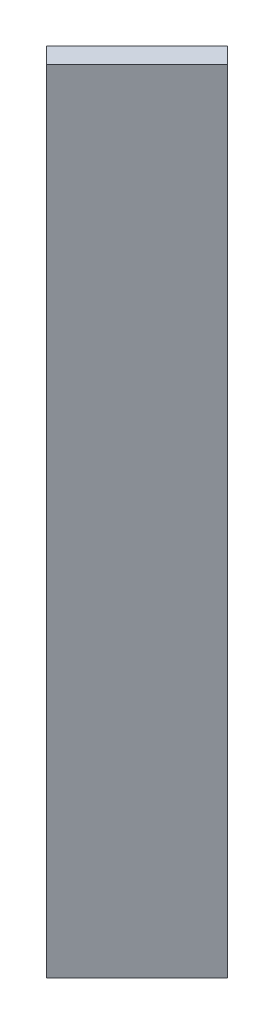
ISO-10303-21;
HEADER;
FILE_DESCRIPTION(('STEP AP214'),'2;1');
FILE_NAME('part.step','',(''),(''),'','','');
FILE_SCHEMA(('AUTOMOTIVE_DESIGN { 1 0 10303 214 1 1 1 1 }'));
ENDSEC;
DATA;
#1=APPLICATION_CONTEXT('core data for automotive mechanical design processes');
#2=APPLICATION_PROTOCOL_DEFINITION('international standard','automotive_design',2000,#1);
#3=PRODUCT_CONTEXT('',#1,'mechanical');
#4=PRODUCT('Part','Part','',(#3));
#5=PRODUCT_RELATED_PRODUCT_CATEGORY('part','',(#4));
#6=PRODUCT_DEFINITION_FORMATION('','',#4);
#7=PRODUCT_DEFINITION_CONTEXT('part definition',#1,'design');
#8=PRODUCT_DEFINITION('design','',#6,#7);
#9=PRODUCT_DEFINITION_SHAPE('','',#8);
#10=(LENGTH_UNIT() NAMED_UNIT(*) SI_UNIT(.MILLI.,.METRE.));
#11=(NAMED_UNIT(*) PLANE_ANGLE_UNIT() SI_UNIT($,.RADIAN.));
#12=(NAMED_UNIT(*) SI_UNIT($,.STERADIAN.) SOLID_ANGLE_UNIT());
#13=UNCERTAINTY_MEASURE_WITH_UNIT(LENGTH_MEASURE(1.E-05),#10,'distance_accuracy_value','');
#14=(GEOMETRIC_REPRESENTATION_CONTEXT(3) GLOBAL_UNCERTAINTY_ASSIGNED_CONTEXT((#13)) GLOBAL_UNIT_ASSIGNED_CONTEXT((#10,
#11,#12)) REPRESENTATION_CONTEXT('',''));
#15=CARTESIAN_POINT('',(0.,0.,0.));
#16=DIRECTION('',(0.,0.,1.));
#17=DIRECTION('',(1.,0.,0.));
#18=AXIS2_PLACEMENT_3D('',#15,#16,#17);
#19=CARTESIAN_POINT('',(10.560155931463,0.,10.560155931463));
#20=DIRECTION('',(-0.707106781186548,0.,-0.707106781186547));
#21=DIRECTION('',(-0.707106781186547,0.,0.707106781186548));
#22=AXIS2_PLACEMENT_3D('',#19,#20,#21);
#23=PLANE('',#22);
#24=DIRECTION('',(0.,-1.,0.));
#25=VECTOR('',#24,1.);
#26=CARTESIAN_POINT('',(-48.2287213378861,0.,69.3490332008122));
#27=LINE('',#26,#25);
#28=CARTESIAN_POINT('',(-48.2287213378861,31.3998645037643,69.3490332008122));
#29=VERTEX_POINT('',#28);
#30=CARTESIAN_POINT('',(-48.2287213378861,-3.20013549623574,69.3490332008122));
#31=VERTEX_POINT('',#30);
#32=EDGE_CURVE('E247',#29,#31,#27,.T.);
#33=ORIENTED_EDGE('',*,*,#32,.T.);
#34=DIRECTION('',(-0.707106781186547,0.,0.707106781186548));
#35=VECTOR('',#34,1.);
#36=CARTESIAN_POINT('',(10.560155931463,-3.20013549623574,10.560155931463));
#37=LINE('',#36,#35);
#38=CARTESIAN_POINT('',(-52.1885193125308,-3.20013549623574,73.3088311754569));
#39=VERTEX_POINT('',#38);
#40=EDGE_CURVE('E250',#31,#39,#37,.T.);
#41=ORIENTED_EDGE('',*,*,#40,.T.);
#42=DIRECTION('',(0.,1.,0.));
#43=VECTOR('',#42,1.);
#44=CARTESIAN_POINT('',(-52.1885193125308,0.,73.3088311754569));
#45=LINE('',#44,#43);
#46=CARTESIAN_POINT('',(-52.1885193125307,31.3998645037643,73.3088311754569));
#47=VERTEX_POINT('',#46);
#48=EDGE_CURVE('E253',#39,#47,#45,.T.);
#49=ORIENTED_EDGE('',*,*,#48,.T.);
#50=DIRECTION('',(0.707106781186547,0.,-0.707106781186548));
#51=VECTOR('',#50,1.);
#52=CARTESIAN_POINT('',(10.560155931463,31.3998645037643,10.560155931463));
#53=LINE('',#52,#51);
#54=EDGE_CURVE('E255',#47,#29,#53,.T.);
#55=ORIENTED_EDGE('',*,*,#54,.T.);
#56=EDGE_LOOP('',(#33,#41,#49,#55));
#57=FACE_BOUND('',#56,.T.);
#58=DIRECTION('',(-0.707106781186547,0.,0.707106781186547));
#59=VECTOR('',#58,1.);
#60=CARTESIAN_POINT('',(-48.8088255907336,-1.73092117145368,69.9291374536598));
#61=LINE('',#60,#59);
#62=CARTESIAN_POINT('',(-48.8088255907336,-1.73092117145368,69.9291374536598));
#63=VERTEX_POINT('',#62);
#64=CARTESIAN_POINT('',(-51.6084150596832,-1.73092117145368,72.7287269226093));
#65=VERTEX_POINT('',#64);
#66=EDGE_CURVE('E220',#63,#65,#61,.T.);
#67=ORIENTED_EDGE('',*,*,#66,.F.);
#68=DIRECTION('',(0.,-1.,0.));
#69=VECTOR('',#68,1.);
#70=CARTESIAN_POINT('',(-48.8088255907336,1.25733359690292,69.9291374536598));
#71=LINE('',#70,#69);
#72=CARTESIAN_POINT('',(-48.8088255907336,1.25733359690292,69.9291374536598));
#73=VERTEX_POINT('',#72);
#74=EDGE_CURVE('E202',#73,#63,#71,.T.);
#75=ORIENTED_EDGE('',*,*,#74,.F.);
#76=DIRECTION('',(0.707106781186547,0.,-0.707106781186547));
#77=VECTOR('',#76,1.);
#78=CARTESIAN_POINT('',(-48.8088255907336,1.25733359690292,69.9291374536598));
#79=LINE('',#78,#77);
#80=CARTESIAN_POINT('',(-51.6084150596832,1.25733359690292,72.7287269226093));
#81=VERTEX_POINT('',#80);
#82=EDGE_CURVE('E225',#81,#73,#79,.T.);
#83=ORIENTED_EDGE('',*,*,#82,.F.);
#84=DIRECTION('',(0.,1.,0.));
#85=VECTOR('',#84,1.);
#86=CARTESIAN_POINT('',(-51.6084150596832,1.25733359690292,72.7287269226093));
#87=LINE('',#86,#85);
#88=EDGE_CURVE('E222',#65,#81,#87,.T.);
#89=ORIENTED_EDGE('',*,*,#88,.F.);
#90=EDGE_LOOP('',(#67,#75,#83,#89));
#91=FACE_BOUND('',#90,.T.);
#92=DIRECTION('',(-0.707106781186547,0.,0.707106781186547));
#93=VECTOR('',#92,1.);
#94=CARTESIAN_POINT('',(-48.8088255907336,2.26907882854632,69.9291374536598));
#95=LINE('',#94,#93);
#96=CARTESIAN_POINT('',(-48.8088255907336,2.26907882854632,69.9291374536598));
#97=VERTEX_POINT('',#96);
#98=CARTESIAN_POINT('',(-51.6084150596832,2.26907882854632,72.7287269226093));
#99=VERTEX_POINT('',#98);
#100=EDGE_CURVE('E193',#97,#99,#95,.T.);
#101=ORIENTED_EDGE('',*,*,#100,.F.);
#102=DIRECTION('',(0.,-1.,0.));
#103=VECTOR('',#102,1.);
#104=CARTESIAN_POINT('',(-48.8088255907336,5.25733359690292,69.9291374536598));
#105=LINE('',#104,#103);
#106=CARTESIAN_POINT('',(-48.8088255907336,5.25733359690292,69.9291374536598));
#107=VERTEX_POINT('',#106);
#108=EDGE_CURVE('E162',#107,#97,#105,.T.);
#109=ORIENTED_EDGE('',*,*,#108,.F.);
#110=DIRECTION('',(0.707106781186547,0.,-0.707106781186547));
#111=VECTOR('',#110,1.);
#112=CARTESIAN_POINT('',(-48.8088255907336,5.25733359690292,69.9291374536598));
#113=LINE('',#112,#111);
#114=CARTESIAN_POINT('',(-51.6084150596832,5.25733359690292,72.7287269226093));
#115=VERTEX_POINT('',#114);
#116=EDGE_CURVE('E197',#115,#107,#113,.T.);
#117=ORIENTED_EDGE('',*,*,#116,.F.);
#118=DIRECTION('',(0.,1.,0.));
#119=VECTOR('',#118,1.);
#120=CARTESIAN_POINT('',(-51.6084150596832,5.25733359690292,72.7287269226093));
#121=LINE('',#120,#119);
#122=EDGE_CURVE('E195',#99,#115,#121,.T.);
#123=ORIENTED_EDGE('',*,*,#122,.F.);
#124=EDGE_LOOP('',(#101,#109,#117,#123));
#125=FACE_BOUND('',#124,.T.);
#126=DIRECTION('',(-0.707106781186547,0.,0.707106781186547));
#127=VECTOR('',#126,1.);
#128=CARTESIAN_POINT('',(-48.8088255907336,6.26907882854632,69.9291374536598));
#129=LINE('',#128,#127);
#130=CARTESIAN_POINT('',(-48.8088255907336,6.26907882854632,69.9291374536598));
#131=VERTEX_POINT('',#130);
#132=CARTESIAN_POINT('',(-51.6084150596832,6.26907882854632,72.7287269226093));
#133=VERTEX_POINT('',#132);
#134=EDGE_CURVE('E156',#131,#133,#129,.T.);
#135=ORIENTED_EDGE('',*,*,#134,.F.);
#136=DIRECTION('',(0.,-1.,0.));
#137=VECTOR('',#136,1.);
#138=CARTESIAN_POINT('',(-48.8088255907336,9.25733359690292,69.9291374536598));
#139=LINE('',#138,#137);
#140=CARTESIAN_POINT('',(-48.8088255907336,9.25733359690292,69.9291374536598));
#141=VERTEX_POINT('',#140);
#142=EDGE_CURVE('E167',#141,#131,#139,.T.);
#143=ORIENTED_EDGE('',*,*,#142,.F.);
#144=DIRECTION('',(0.707106781186547,0.,-0.707106781186547));
#145=VECTOR('',#144,1.);
#146=CARTESIAN_POINT('',(-48.8088255907336,9.25733359690292,69.9291374536598));
#147=LINE('',#146,#145);
#148=CARTESIAN_POINT('',(-51.6084150596832,9.25733359690292,72.7287269226093));
#149=VERTEX_POINT('',#148);
#150=EDGE_CURVE('E177',#149,#141,#147,.T.);
#151=ORIENTED_EDGE('',*,*,#150,.F.);
#152=DIRECTION('',(0.,1.,0.));
#153=VECTOR('',#152,1.);
#154=CARTESIAN_POINT('',(-51.6084150596832,9.25733359690292,72.7287269226093));
#155=LINE('',#154,#153);
#156=EDGE_CURVE('E175',#133,#149,#155,.T.);
#157=ORIENTED_EDGE('',*,*,#156,.F.);
#158=EDGE_LOOP('',(#135,#143,#151,#157));
#159=FACE_BOUND('',#158,.T.);
#160=ADVANCED_FACE('F37',(#57,#91,#125,#159),#23,.T.);
#161=CARTESIAN_POINT('',(-48.2287213378861,0.,69.3490332008122));
#162=DIRECTION('',(-0.707106781186547,0.,0.707106781186548));
#163=DIRECTION('',(0.707106781186548,0.,0.707106781186547));
#164=AXIS2_PLACEMENT_3D('',#161,#162,#163);
#165=PLANE('',#164);
#166=DIRECTION('',(0.,-1.,0.));
#167=VECTOR('',#166,1.);
#168=CARTESIAN_POINT('',(-47.5216145566996,0.,70.0561399819988));
#169=LINE('',#168,#167);
#170=CARTESIAN_POINT('',(-47.5216145566996,31.3998645037643,70.0561399819988));
#171=VERTEX_POINT('',#170);
#172=CARTESIAN_POINT('',(-47.5216145566996,-3.20013549623574,70.0561399819988));
#173=VERTEX_POINT('',#172);
#174=EDGE_CURVE('E230',#171,#173,#169,.T.);
#175=ORIENTED_EDGE('',*,*,#174,.T.);
#176=DIRECTION('',(0.707106781186548,0.,0.707106781186547));
#177=VECTOR('',#176,1.);
#178=CARTESIAN_POINT('',(-48.2287213378861,-3.20013549623574,69.3490332008122));
#179=LINE('',#178,#177);
#180=EDGE_CURVE('E11',#31,#173,#179,.T.);
#181=ORIENTED_EDGE('',*,*,#180,.F.);
#182=ORIENTED_EDGE('',*,*,#32,.F.);
#183=DIRECTION('',(0.707106781186548,0.,0.707106781186547));
#184=VECTOR('',#183,1.);
#185=CARTESIAN_POINT('',(-48.2287213378861,31.3998645037643,69.3490332008122));
#186=LINE('',#185,#184);
#187=EDGE_CURVE('E257',#29,#171,#186,.T.);
#188=ORIENTED_EDGE('',*,*,#187,.T.);
#189=EDGE_LOOP('',(#175,#181,#182,#188));
#190=FACE_BOUND('',#189,.T.);
#191=ADVANCED_FACE('F39',(#190),#165,.F.);
#192=CARTESIAN_POINT('',(10.560155931463,-3.20013549623574,10.560155931463));
#193=DIRECTION('',(0.,1.,0.));
#194=DIRECTION('',(0.,0.,1.));
#195=AXIS2_PLACEMENT_3D('',#192,#193,#194);
#196=PLANE('',#195);
#197=DIRECTION('',(-0.707106781186547,0.,0.707106781186548));
#198=VECTOR('',#197,1.);
#199=CARTESIAN_POINT('',(11.2672627126496,-3.20013549623574,11.2672627126496));
#200=LINE('',#199,#198);
#201=CARTESIAN_POINT('',(-51.4814125313442,-3.20013549623574,74.0159379566434));
#202=VERTEX_POINT('',#201);
#203=EDGE_CURVE('E260',#173,#202,#200,.T.);
#204=ORIENTED_EDGE('',*,*,#203,.T.);
#205=DIRECTION('',(0.707106781186548,0.,0.707106781186547));
#206=VECTOR('',#205,1.);
#207=CARTESIAN_POINT('',(-52.1885193125308,-3.20013549623574,73.3088311754569));
#208=LINE('',#207,#206);
#209=EDGE_CURVE('E45',#39,#202,#208,.T.);
#210=ORIENTED_EDGE('',*,*,#209,.F.);
#211=ORIENTED_EDGE('',*,*,#40,.F.);
#212=ORIENTED_EDGE('',*,*,#180,.T.);
#213=EDGE_LOOP('',(#204,#210,#211,#212));
#214=FACE_BOUND('',#213,.T.);
#215=ADVANCED_FACE('F290',(#214),#196,.F.);
#216=CARTESIAN_POINT('',(-52.1885193125308,0.,73.3088311754569));
#217=DIRECTION('',(0.707106781186547,0.,-0.707106781186548));
#218=DIRECTION('',(-0.707106781186548,0.,-0.707106781186547));
#219=AXIS2_PLACEMENT_3D('',#216,#217,#218);
#220=PLANE('',#219);
#221=DIRECTION('',(0.,1.,0.));
#222=VECTOR('',#221,1.);
#223=CARTESIAN_POINT('',(-51.4814125313442,0.,74.0159379566434));
#224=LINE('',#223,#222);
#225=CARTESIAN_POINT('',(-51.4814125313442,31.3998645037643,74.0159379566434));
#226=VERTEX_POINT('',#225);
#227=EDGE_CURVE('E262',#202,#226,#224,.T.);
#228=ORIENTED_EDGE('',*,*,#227,.T.);
#229=DIRECTION('',(0.707106781186548,0.,0.707106781186547));
#230=VECTOR('',#229,1.);
#231=CARTESIAN_POINT('',(-52.1885193125307,31.3998645037643,73.3088311754569));
#232=LINE('',#231,#230);
#233=EDGE_CURVE('E267',#47,#226,#232,.T.);
#234=ORIENTED_EDGE('',*,*,#233,.F.);
#235=ORIENTED_EDGE('',*,*,#48,.F.);
#236=ORIENTED_EDGE('',*,*,#209,.T.);
#237=EDGE_LOOP('',(#228,#234,#235,#236));
#238=FACE_BOUND('',#237,.T.);
#239=ADVANCED_FACE('F274',(#238),#220,.F.);
#240=CARTESIAN_POINT('',(10.560155931463,31.3998645037643,10.560155931463));
#241=DIRECTION('',(0.,-1.,0.));
#242=DIRECTION('',(0.,0.,-1.));
#243=AXIS2_PLACEMENT_3D('',#240,#241,#242);
#244=PLANE('',#243);
#245=DIRECTION('',(0.707106781186547,0.,-0.707106781186548));
#246=VECTOR('',#245,1.);
#247=CARTESIAN_POINT('',(11.2672627126496,31.3998645037643,11.2672627126496));
#248=LINE('',#247,#246);
#249=EDGE_CURVE('E251',#226,#171,#248,.T.);
#250=ORIENTED_EDGE('',*,*,#249,.T.);
#251=ORIENTED_EDGE('',*,*,#187,.F.);
#252=ORIENTED_EDGE('',*,*,#54,.F.);
#253=ORIENTED_EDGE('',*,*,#233,.T.);
#254=EDGE_LOOP('',(#250,#251,#252,#253));
#255=FACE_BOUND('',#254,.T.);
#256=ADVANCED_FACE('F283',(#255),#244,.F.);
#257=CARTESIAN_POINT('',(11.2672627126496,0.,11.2672627126496));
#258=DIRECTION('',(-0.707106781186548,0.,-0.707106781186547));
#259=DIRECTION('',(-0.707106781186547,0.,0.707106781186548));
#260=AXIS2_PLACEMENT_3D('',#257,#258,#259);
#261=PLANE('',#260);
#262=ORIENTED_EDGE('',*,*,#174,.F.);
#263=ORIENTED_EDGE('',*,*,#249,.F.);
#264=ORIENTED_EDGE('',*,*,#227,.F.);
#265=ORIENTED_EDGE('',*,*,#203,.F.);
#266=EDGE_LOOP('',(#262,#263,#264,#265));
#267=FACE_BOUND('',#266,.T.);
#268=ADVANCED_FACE('F280',(#267),#261,.F.);
#269=CARTESIAN_POINT('',(-48.8088255907336,1.25733359690292,69.9291374536598));
#270=DIRECTION('',(0.515038074910054,0.,-0.857167300702112));
#271=DIRECTION('',(-0.857167300702113,0.,-0.515038074910054));
#272=AXIS2_PLACEMENT_3D('',#269,#270,#271);
#273=PLANE('',#272);
#274=ORIENTED_EDGE('',*,*,#74,.T.);
#275=DIRECTION('',(0.833133866136367,-0.235138839312811,0.500597330539521));
#276=VECTOR('',#275,1.);
#277=CARTESIAN_POINT('',(-48.8088255907336,-1.73092117145368,69.9291374536598));
#278=LINE('',#277,#276);
#279=CARTESIAN_POINT('',(-50.1339380448387,-1.3569291671889,69.1329295642051));
#280=VERTEX_POINT('',#279);
#281=EDGE_CURVE('E228',#280,#63,#278,.T.);
#282=ORIENTED_EDGE('',*,*,#281,.F.);
#283=DIRECTION('',(0.,1.,0.));
#284=VECTOR('',#283,1.);
#285=CARTESIAN_POINT('',(-50.1339380448387,1.25733359690292,69.1329295642051));
#286=LINE('',#285,#284);
#287=CARTESIAN_POINT('',(-50.1339380448387,0.883341592638149,69.1329295642051));
#288=VERTEX_POINT('',#287);
#289=EDGE_CURVE('E227',#288,#280,#286,.F.);
#290=ORIENTED_EDGE('',*,*,#289,.F.);
#291=DIRECTION('',(0.833133866136367,0.23513883931281,0.500597330539521));
#292=VECTOR('',#291,1.);
#293=CARTESIAN_POINT('',(-48.8088255907336,1.25733359690292,69.9291374536598));
#294=LINE('',#293,#292);
#295=EDGE_CURVE('E232',#288,#73,#294,.T.);
#296=ORIENTED_EDGE('',*,*,#295,.T.);
#297=EDGE_LOOP('',(#274,#282,#290,#296));
#298=FACE_BOUND('',#297,.T.);
#299=ADVANCED_FACE('F307',(#298),#273,.T.);
#300=CARTESIAN_POINT('',(-48.8088255907336,-1.73092117145368,69.9291374536598));
#301=DIRECTION('',(-0.171064612896029,-0.970295726275996,-0.171064612896029));
#302=DIRECTION('',(0.984812040359576,-0.173623861156264,0.));
#303=AXIS2_PLACEMENT_3D('',#300,#301,#302);
#304=PLANE('',#303);
#305=ORIENTED_EDGE('',*,*,#66,.T.);
#306=DIRECTION('',(0.500597330539522,-0.235138839312811,0.833133866136366));
#307=VECTOR('',#306,1.);
#308=CARTESIAN_POINT('',(-51.96016215573,-1.56569974726641,72.1433214476824));
#309=LINE('',#308,#307);
#310=CARTESIAN_POINT('',(-52.4046229491379,-1.3569291671889,71.4036144685043));
#311=VERTEX_POINT('',#310);
#312=EDGE_CURVE('E231',#311,#65,#309,.T.);
#313=ORIENTED_EDGE('',*,*,#312,.F.);
#314=DIRECTION('',(0.707106781186548,0.,-0.707106781186548));
#315=VECTOR('',#314,1.);
#316=CARTESIAN_POINT('',(-49.8694857625135,-1.3569291671889,68.8684772818799));
#317=LINE('',#316,#315);
#318=EDGE_CURVE('E242',#280,#311,#317,.F.);
#319=ORIENTED_EDGE('',*,*,#318,.F.);
#320=ORIENTED_EDGE('',*,*,#281,.T.);
#321=EDGE_LOOP('',(#305,#313,#319,#320));
#322=FACE_BOUND('',#321,.T.);
#323=ADVANCED_FACE('F303',(#322),#304,.T.);
#324=CARTESIAN_POINT('',(-51.6084150596832,1.25733359690292,72.7287269226093));
#325=DIRECTION('',(-0.857167300702112,0.,0.515038074910055));
#326=DIRECTION('',(0.515038074910055,0.,0.857167300702112));
#327=AXIS2_PLACEMENT_3D('',#324,#325,#326);
#328=PLANE('',#327);
#329=ORIENTED_EDGE('',*,*,#88,.T.);
#330=DIRECTION('',(0.500597330539522,0.23513883931281,0.833133866136366));
#331=VECTOR('',#330,1.);
#332=CARTESIAN_POINT('',(-52.0744540455257,1.03842738322534,71.9531078004963));
#333=LINE('',#332,#331);
#334=CARTESIAN_POINT('',(-52.4046229491379,0.883341592638151,71.4036144685043));
#335=VERTEX_POINT('',#334);
#336=EDGE_CURVE('E235',#335,#81,#333,.T.);
#337=ORIENTED_EDGE('',*,*,#336,.F.);
#338=DIRECTION('',(0.,-1.,0.));
#339=VECTOR('',#338,1.);
#340=CARTESIAN_POINT('',(-52.4046229491379,1.25733359690292,71.4036144685043));
#341=LINE('',#340,#339);
#342=EDGE_CURVE('E244',#311,#335,#341,.F.);
#343=ORIENTED_EDGE('',*,*,#342,.F.);
#344=ORIENTED_EDGE('',*,*,#312,.T.);
#345=EDGE_LOOP('',(#329,#337,#343,#344));
#346=FACE_BOUND('',#345,.T.);
#347=ADVANCED_FACE('F333',(#346),#328,.T.);
#348=CARTESIAN_POINT('',(-48.8088255907336,1.25733359690292,69.9291374536598));
#349=DIRECTION('',(-0.171064612896029,0.970295726275996,-0.171064612896029));
#350=DIRECTION('',(0.,0.173623861156263,0.984812040359576));
#351=AXIS2_PLACEMENT_3D('',#348,#349,#350);
#352=PLANE('',#351);
#353=ORIENTED_EDGE('',*,*,#82,.T.);
#354=ORIENTED_EDGE('',*,*,#295,.F.);
#355=DIRECTION('',(-0.707106781186548,0.,0.707106781186548));
#356=VECTOR('',#355,1.);
#357=CARTESIAN_POINT('',(-49.8694857625135,0.883341592638149,68.8684772818799));
#358=LINE('',#357,#356);
#359=EDGE_CURVE('E236',#335,#288,#358,.F.);
#360=ORIENTED_EDGE('',*,*,#359,.F.);
#361=ORIENTED_EDGE('',*,*,#336,.T.);
#362=EDGE_LOOP('',(#353,#354,#360,#361));
#363=FACE_BOUND('',#362,.T.);
#364=ADVANCED_FACE('F341',(#363),#352,.T.);
#365=CARTESIAN_POINT('',(9.49949575968323,0.,9.49949575968323));
#366=DIRECTION('',(-0.707106781186547,0.,-0.707106781186547));
#367=DIRECTION('',(-0.707106781186548,0.,0.707106781186548));
#368=AXIS2_PLACEMENT_3D('',#365,#366,#367);
#369=PLANE('',#368);
#370=ORIENTED_EDGE('',*,*,#289,.T.);
#371=ORIENTED_EDGE('',*,*,#318,.T.);
#372=ORIENTED_EDGE('',*,*,#342,.T.);
#373=ORIENTED_EDGE('',*,*,#359,.T.);
#374=EDGE_LOOP('',(#370,#371,#372,#373));
#375=FACE_BOUND('',#374,.T.);
#376=ADVANCED_FACE('F349',(#375),#369,.T.);
#377=CARTESIAN_POINT('',(-48.8088255907336,5.25733359690292,69.9291374536598));
#378=DIRECTION('',(0.515038074910054,0.,-0.857167300702113));
#379=DIRECTION('',(-0.857167300702113,0.,-0.515038074910054));
#380=AXIS2_PLACEMENT_3D('',#377,#378,#379);
#381=PLANE('',#380);
#382=ORIENTED_EDGE('',*,*,#108,.T.);
#383=DIRECTION('',(0.833133866136367,-0.235138839312811,0.500597330539521));
#384=VECTOR('',#383,1.);
#385=CARTESIAN_POINT('',(-48.8088255907336,2.26907882854632,69.9291374536598));
#386=LINE('',#385,#384);
#387=CARTESIAN_POINT('',(-50.1339380448386,2.64307083281109,69.1329295642051));
#388=VERTEX_POINT('',#387);
#389=EDGE_CURVE('E200',#388,#97,#386,.T.);
#390=ORIENTED_EDGE('',*,*,#389,.F.);
#391=DIRECTION('',(0.,1.,0.));
#392=VECTOR('',#391,1.);
#393=CARTESIAN_POINT('',(-50.1339380448386,5.25733359690292,69.1329295642051));
#394=LINE('',#393,#392);
#395=CARTESIAN_POINT('',(-50.1339380448386,4.88334159263815,69.1329295642051));
#396=VERTEX_POINT('',#395);
#397=EDGE_CURVE('E199',#396,#388,#394,.F.);
#398=ORIENTED_EDGE('',*,*,#397,.F.);
#399=DIRECTION('',(0.833133866136367,0.23513883931281,0.500597330539521));
#400=VECTOR('',#399,1.);
#401=CARTESIAN_POINT('',(-48.8088255907336,5.25733359690292,69.9291374536598));
#402=LINE('',#401,#400);
#403=EDGE_CURVE('E204',#396,#107,#402,.T.);
#404=ORIENTED_EDGE('',*,*,#403,.T.);
#405=EDGE_LOOP('',(#382,#390,#398,#404));
#406=FACE_BOUND('',#405,.T.);
#407=ADVANCED_FACE('F358',(#406),#381,.T.);
#408=CARTESIAN_POINT('',(-48.8088255907336,2.26907882854632,69.9291374536598));
#409=DIRECTION('',(-0.171064612896029,-0.970295726275996,-0.171064612896029));
#410=DIRECTION('',(0.984812040359576,-0.173623861156264,0.));
#411=AXIS2_PLACEMENT_3D('',#408,#409,#410);
#412=PLANE('',#411);
#413=ORIENTED_EDGE('',*,*,#100,.T.);
#414=DIRECTION('',(0.500597330539522,-0.235138839312811,0.833133866136366));
#415=VECTOR('',#414,1.);
#416=CARTESIAN_POINT('',(-51.96016215573,2.43430025273359,72.1433214476824));
#417=LINE('',#416,#415);
#418=CARTESIAN_POINT('',(-52.4046229491379,2.6430708328111,71.4036144685043));
#419=VERTEX_POINT('',#418);
#420=EDGE_CURVE('E203',#419,#99,#417,.T.);
#421=ORIENTED_EDGE('',*,*,#420,.F.);
#422=DIRECTION('',(0.707106781186547,0.,-0.707106781186547));
#423=VECTOR('',#422,1.);
#424=CARTESIAN_POINT('',(-49.8694857625135,2.64307083281109,68.8684772818799));
#425=LINE('',#424,#423);
#426=EDGE_CURVE('E213',#388,#419,#425,.F.);
#427=ORIENTED_EDGE('',*,*,#426,.F.);
#428=ORIENTED_EDGE('',*,*,#389,.T.);
#429=EDGE_LOOP('',(#413,#421,#427,#428));
#430=FACE_BOUND('',#429,.T.);
#431=ADVANCED_FACE('F367',(#430),#412,.T.);
#432=CARTESIAN_POINT('',(-51.6084150596832,5.25733359690292,72.7287269226093));
#433=DIRECTION('',(-0.857167300702112,0.,0.515038074910055));
#434=DIRECTION('',(0.515038074910055,0.,0.857167300702112));
#435=AXIS2_PLACEMENT_3D('',#432,#433,#434);
#436=PLANE('',#435);
#437=ORIENTED_EDGE('',*,*,#122,.T.);
#438=DIRECTION('',(0.500597330539522,0.23513883931281,0.833133866136366));
#439=VECTOR('',#438,1.);
#440=CARTESIAN_POINT('',(-52.0744540455257,5.03842738322534,71.9531078004963));
#441=LINE('',#440,#439);
#442=CARTESIAN_POINT('',(-52.4046229491379,4.88334159263815,71.4036144685043));
#443=VERTEX_POINT('',#442);
#444=EDGE_CURVE('E60',#443,#115,#441,.T.);
#445=ORIENTED_EDGE('',*,*,#444,.F.);
#446=DIRECTION('',(0.,-1.,0.));
#447=VECTOR('',#446,1.);
#448=CARTESIAN_POINT('',(-52.4046229491379,5.25733359690292,71.4036144685044));
#449=LINE('',#448,#447);
#450=EDGE_CURVE('E215',#419,#443,#449,.F.);
#451=ORIENTED_EDGE('',*,*,#450,.F.);
#452=ORIENTED_EDGE('',*,*,#420,.T.);
#453=EDGE_LOOP('',(#437,#445,#451,#452));
#454=FACE_BOUND('',#453,.T.);
#455=ADVANCED_FACE('F376',(#454),#436,.T.);
#456=CARTESIAN_POINT('',(-48.8088255907336,5.25733359690292,69.9291374536598));
#457=DIRECTION('',(-0.171064612896029,0.970295726275996,-0.171064612896029));
#458=DIRECTION('',(0.,0.173623861156263,0.984812040359576));
#459=AXIS2_PLACEMENT_3D('',#456,#457,#458);
#460=PLANE('',#459);
#461=ORIENTED_EDGE('',*,*,#116,.T.);
#462=ORIENTED_EDGE('',*,*,#403,.F.);
#463=DIRECTION('',(-0.707106781186547,0.,0.707106781186547));
#464=VECTOR('',#463,1.);
#465=CARTESIAN_POINT('',(-49.8694857625135,4.88334159263815,68.8684772818799));
#466=LINE('',#465,#464);
#467=EDGE_CURVE('E207',#443,#396,#466,.F.);
#468=ORIENTED_EDGE('',*,*,#467,.F.);
#469=ORIENTED_EDGE('',*,*,#444,.T.);
#470=EDGE_LOOP('',(#461,#462,#468,#469));
#471=FACE_BOUND('',#470,.T.);
#472=ADVANCED_FACE('F385',(#471),#460,.T.);
#473=CARTESIAN_POINT('',(9.49949575968324,0.,9.49949575968324));
#474=DIRECTION('',(-0.707106781186548,0.,-0.707106781186548));
#475=DIRECTION('',(-0.707106781186548,0.,0.707106781186548));
#476=AXIS2_PLACEMENT_3D('',#473,#474,#475);
#477=PLANE('',#476);
#478=ORIENTED_EDGE('',*,*,#397,.T.);
#479=ORIENTED_EDGE('',*,*,#426,.T.);
#480=ORIENTED_EDGE('',*,*,#450,.T.);
#481=ORIENTED_EDGE('',*,*,#467,.T.);
#482=EDGE_LOOP('',(#478,#479,#480,#481));
#483=FACE_BOUND('',#482,.T.);
#484=ADVANCED_FACE('F394',(#483),#477,.T.);
#485=CARTESIAN_POINT('',(-48.8088255907336,9.25733359690292,69.9291374536598));
#486=DIRECTION('',(0.515038074910054,0.,-0.857167300702113));
#487=DIRECTION('',(-0.857167300702113,0.,-0.515038074910054));
#488=AXIS2_PLACEMENT_3D('',#485,#486,#487);
#489=PLANE('',#488);
#490=ORIENTED_EDGE('',*,*,#142,.T.);
#491=DIRECTION('',(0.833133866136367,-0.235138839312811,0.500597330539521));
#492=VECTOR('',#491,1.);
#493=CARTESIAN_POINT('',(-48.8088255907336,6.26907882854632,69.9291374536598));
#494=LINE('',#493,#492);
#495=CARTESIAN_POINT('',(-50.1339380448386,6.64307083281109,69.1329295642051));
#496=VERTEX_POINT('',#495);
#497=EDGE_CURVE('E151',#496,#131,#494,.T.);
#498=ORIENTED_EDGE('',*,*,#497,.F.);
#499=DIRECTION('',(0.,1.,0.));
#500=VECTOR('',#499,1.);
#501=CARTESIAN_POINT('',(-50.1339380448386,9.25733359690292,69.1329295642051));
#502=LINE('',#501,#500);
#503=CARTESIAN_POINT('',(-50.1339380448386,8.88334159263815,69.1329295642051));
#504=VERTEX_POINT('',#503);
#505=EDGE_CURVE('E180',#504,#496,#502,.F.);
#506=ORIENTED_EDGE('',*,*,#505,.F.);
#507=DIRECTION('',(0.833133866136367,0.23513883931281,0.500597330539521));
#508=VECTOR('',#507,1.);
#509=CARTESIAN_POINT('',(-48.8088255907336,9.25733359690292,69.9291374536598));
#510=LINE('',#509,#508);
#511=EDGE_CURVE('E170',#504,#141,#510,.T.);
#512=ORIENTED_EDGE('',*,*,#511,.T.);
#513=EDGE_LOOP('',(#490,#498,#506,#512));
#514=FACE_BOUND('',#513,.T.);
#515=ADVANCED_FACE('F168',(#514),#489,.T.);
#516=CARTESIAN_POINT('',(-48.8088255907336,6.26907882854632,69.9291374536598));
#517=DIRECTION('',(-0.171064612896029,-0.970295726275996,-0.171064612896029));
#518=DIRECTION('',(0.984812040359576,-0.173623861156264,0.));
#519=AXIS2_PLACEMENT_3D('',#516,#517,#518);
#520=PLANE('',#519);
#521=ORIENTED_EDGE('',*,*,#134,.T.);
#522=DIRECTION('',(0.500597330539522,-0.235138839312811,0.833133866136366));
#523=VECTOR('',#522,1.);
#524=CARTESIAN_POINT('',(-51.96016215573,6.43430025273359,72.1433214476824));
#525=LINE('',#524,#523);
#526=CARTESIAN_POINT('',(-52.4046229491379,6.6430708328111,71.4036144685043));
#527=VERTEX_POINT('',#526);
#528=EDGE_CURVE('E163',#527,#133,#525,.T.);
#529=ORIENTED_EDGE('',*,*,#528,.F.);
#530=DIRECTION('',(0.707106781186547,0.,-0.707106781186547));
#531=VECTOR('',#530,1.);
#532=CARTESIAN_POINT('',(-49.8694857625135,6.64307083281109,68.8684772818799));
#533=LINE('',#532,#531);
#534=EDGE_CURVE('E158',#496,#527,#533,.F.);
#535=ORIENTED_EDGE('',*,*,#534,.F.);
#536=ORIENTED_EDGE('',*,*,#497,.T.);
#537=EDGE_LOOP('',(#521,#529,#535,#536));
#538=FACE_BOUND('',#537,.T.);
#539=ADVANCED_FACE('F153',(#538),#520,.T.);
#540=CARTESIAN_POINT('',(-51.6084150596832,9.25733359690292,72.7287269226093));
#541=DIRECTION('',(-0.857167300702112,0.,0.515038074910055));
#542=DIRECTION('',(0.515038074910055,0.,0.857167300702112));
#543=AXIS2_PLACEMENT_3D('',#540,#541,#542);
#544=PLANE('',#543);
#545=ORIENTED_EDGE('',*,*,#156,.T.);
#546=DIRECTION('',(0.500597330539522,0.235138839312811,0.833133866136366));
#547=VECTOR('',#546,1.);
#548=CARTESIAN_POINT('',(-52.0744540455257,9.03842738322534,71.9531078004963));
#549=LINE('',#548,#547);
#550=CARTESIAN_POINT('',(-52.4046229491379,8.88334159263815,71.4036144685043));
#551=VERTEX_POINT('',#550);
#552=EDGE_CURVE('E52',#551,#149,#549,.T.);
#553=ORIENTED_EDGE('',*,*,#552,.F.);
#554=DIRECTION('',(0.,-1.,0.));
#555=VECTOR('',#554,1.);
#556=CARTESIAN_POINT('',(-52.4046229491379,9.25733359690292,71.4036144685044));
#557=LINE('',#556,#555);
#558=EDGE_CURVE('E188',#527,#551,#557,.F.);
#559=ORIENTED_EDGE('',*,*,#558,.F.);
#560=ORIENTED_EDGE('',*,*,#528,.T.);
#561=EDGE_LOOP('',(#545,#553,#559,#560));
#562=FACE_BOUND('',#561,.T.);
#563=ADVANCED_FACE('F417',(#562),#544,.T.);
#564=CARTESIAN_POINT('',(-48.8088255907336,9.25733359690292,69.9291374536598));
#565=DIRECTION('',(-0.171064612896029,0.970295726275996,-0.171064612896029));
#566=DIRECTION('',(0.,0.173623861156264,0.984812040359576));
#567=AXIS2_PLACEMENT_3D('',#564,#565,#566);
#568=PLANE('',#567);
#569=ORIENTED_EDGE('',*,*,#150,.T.);
#570=ORIENTED_EDGE('',*,*,#511,.F.);
#571=DIRECTION('',(-0.707106781186547,0.,0.707106781186547));
#572=VECTOR('',#571,1.);
#573=CARTESIAN_POINT('',(-49.8694857625135,8.88334159263815,68.8684772818799));
#574=LINE('',#573,#572);
#575=EDGE_CURVE('E183',#551,#504,#574,.F.);
#576=ORIENTED_EDGE('',*,*,#575,.F.);
#577=ORIENTED_EDGE('',*,*,#552,.T.);
#578=EDGE_LOOP('',(#569,#570,#576,#577));
#579=FACE_BOUND('',#578,.T.);
#580=ADVANCED_FACE('F425',(#579),#568,.T.);
#581=CARTESIAN_POINT('',(9.49949575968324,0.,9.49949575968324));
#582=DIRECTION('',(-0.707106781186548,0.,-0.707106781186548));
#583=DIRECTION('',(-0.707106781186548,0.,0.707106781186548));
#584=AXIS2_PLACEMENT_3D('',#581,#582,#583);
#585=PLANE('',#584);
#586=ORIENTED_EDGE('',*,*,#505,.T.);
#587=ORIENTED_EDGE('',*,*,#534,.T.);
#588=ORIENTED_EDGE('',*,*,#558,.T.);
#589=ORIENTED_EDGE('',*,*,#575,.T.);
#590=EDGE_LOOP('',(#586,#587,#588,#589));
#591=FACE_BOUND('',#590,.T.);
#592=ADVANCED_FACE('F434',(#591),#585,.T.);
#593=CLOSED_SHELL('',(#160,#191,#215,#239,#256,#268,#299,#323,#347,#364,#376,#407,#431,#455,
#472,#484,#515,#539,#563,#580,#592));
#594=MANIFOLD_SOLID_BREP('B2',#593);
#595=ADVANCED_BREP_SHAPE_REPRESENTATION('',(#18,#594),#14);
#596=SHAPE_DEFINITION_REPRESENTATION(#9,#595);
ENDSEC;
END-ISO-10303-21;
